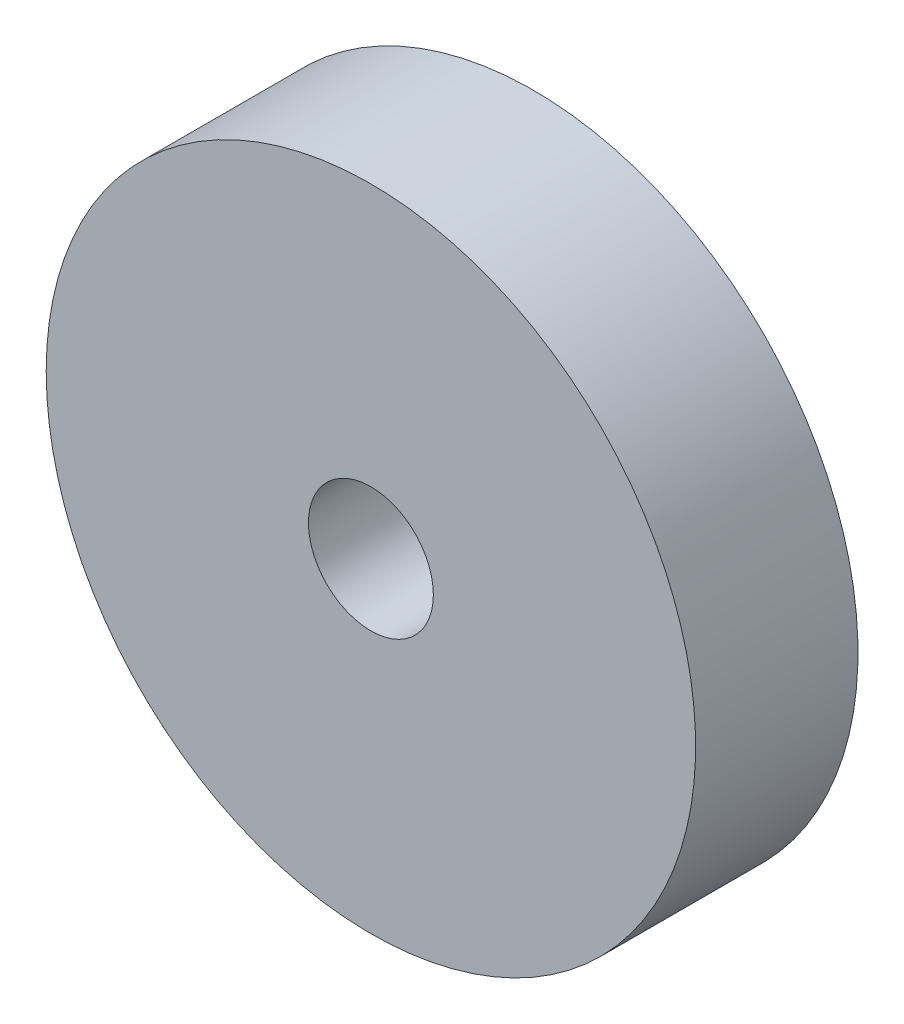
ISO-10303-21;
HEADER;
FILE_DESCRIPTION(('STEP AP214'),'2;1');
FILE_NAME('part.step','',(''),(''),'','','');
FILE_SCHEMA(('AUTOMOTIVE_DESIGN { 1 0 10303 214 1 1 1 1 }'));
ENDSEC;
DATA;
#1=APPLICATION_CONTEXT('core data for automotive mechanical design processes');
#2=APPLICATION_PROTOCOL_DEFINITION('international standard','automotive_design',2000,#1);
#3=PRODUCT_CONTEXT('',#1,'mechanical');
#4=PRODUCT('Part','Part','',(#3));
#5=PRODUCT_RELATED_PRODUCT_CATEGORY('part','',(#4));
#6=PRODUCT_DEFINITION_FORMATION('','',#4);
#7=PRODUCT_DEFINITION_CONTEXT('part definition',#1,'design');
#8=PRODUCT_DEFINITION('design','',#6,#7);
#9=PRODUCT_DEFINITION_SHAPE('','',#8);
#10=(LENGTH_UNIT() NAMED_UNIT(*) SI_UNIT(.MILLI.,.METRE.));
#11=(NAMED_UNIT(*) PLANE_ANGLE_UNIT() SI_UNIT($,.RADIAN.));
#12=(NAMED_UNIT(*) SI_UNIT($,.STERADIAN.) SOLID_ANGLE_UNIT());
#13=UNCERTAINTY_MEASURE_WITH_UNIT(LENGTH_MEASURE(1.E-05),#10,'distance_accuracy_value','');
#14=(GEOMETRIC_REPRESENTATION_CONTEXT(3) GLOBAL_UNCERTAINTY_ASSIGNED_CONTEXT((#13)) GLOBAL_UNIT_ASSIGNED_CONTEXT((#10,
#11,#12)) REPRESENTATION_CONTEXT('',''));
#15=CARTESIAN_POINT('',(0.,0.,0.));
#16=DIRECTION('',(0.,0.,1.));
#17=DIRECTION('',(1.,0.,0.));
#18=AXIS2_PLACEMENT_3D('',#15,#16,#17);
#19=CARTESIAN_POINT('',(0.,0.,6.5));
#20=DIRECTION('',(0.,0.,-1.));
#21=DIRECTION('',(-1.,0.,0.));
#22=AXIS2_PLACEMENT_3D('',#19,#20,#21);
#23=CYLINDRICAL_SURFACE('',#22,13.);
#24=CARTESIAN_POINT('',(0.,0.,6.5));
#25=DIRECTION('',(0.,0.,1.));
#26=DIRECTION('',(1.,0.,0.));
#27=AXIS2_PLACEMENT_3D('',#24,#25,#26);
#28=CIRCLE('',#27,13.);
#29=CARTESIAN_POINT('',(-13.,0.,6.5));
#30=VERTEX_POINT('',#29);
#31=EDGE_CURVE('E10',#30,#30,#28,.T.);
#32=CARTESIAN_POINT('',(0.,0.,0.));
#33=DIRECTION('',(0.,0.,1.));
#34=DIRECTION('',(1.,0.,0.));
#35=AXIS2_PLACEMENT_3D('',#32,#33,#34);
#36=CIRCLE('',#35,13.);
#37=CARTESIAN_POINT('',(-13.,0.,0.));
#38=VERTEX_POINT('',#37);
#39=EDGE_CURVE('E34',#38,#38,#36,.T.);
#40=CARTESIAN_POINT('',(-13.,0.,6.5));
#41=CARTESIAN_POINT('',(-13.,0.,6.43229166666667));
#42=CARTESIAN_POINT('',(-13.,0.,6.36458333333333));
#43=CARTESIAN_POINT('',(-13.,0.,6.22916666666667));
#44=CARTESIAN_POINT('',(-13.,0.,6.16145833333333));
#45=CARTESIAN_POINT('',(-13.,0.,6.02604166666667));
#46=CARTESIAN_POINT('',(-13.,0.,5.95833333333333));
#47=CARTESIAN_POINT('',(-13.,0.,5.82291666666667));
#48=CARTESIAN_POINT('',(-13.,0.,5.75520833333333));
#49=CARTESIAN_POINT('',(-13.,0.,5.61979166666667));
#50=CARTESIAN_POINT('',(-13.,0.,5.55208333333333));
#51=CARTESIAN_POINT('',(-13.,0.,5.41666666666667));
#52=CARTESIAN_POINT('',(-13.,0.,5.34895833333333));
#53=CARTESIAN_POINT('',(-13.,0.,5.21354166666667));
#54=CARTESIAN_POINT('',(-13.,0.,5.14583333333333));
#55=CARTESIAN_POINT('',(-13.,0.,5.01041666666667));
#56=CARTESIAN_POINT('',(-13.,0.,4.94270833333333));
#57=CARTESIAN_POINT('',(-13.,0.,4.80729166666667));
#58=CARTESIAN_POINT('',(-13.,0.,4.73958333333333));
#59=CARTESIAN_POINT('',(-13.,0.,4.60416666666667));
#60=CARTESIAN_POINT('',(-13.,0.,4.53645833333333));
#61=CARTESIAN_POINT('',(-13.,0.,4.40104166666667));
#62=CARTESIAN_POINT('',(-13.,0.,4.33333333333333));
#63=CARTESIAN_POINT('',(-13.,0.,4.19791666666667));
#64=CARTESIAN_POINT('',(-13.,0.,4.13020833333333));
#65=CARTESIAN_POINT('',(-13.,0.,3.99479166666667));
#66=CARTESIAN_POINT('',(-13.,0.,3.92708333333333));
#67=CARTESIAN_POINT('',(-13.,0.,3.79166666666667));
#68=CARTESIAN_POINT('',(-13.,0.,3.72395833333333));
#69=CARTESIAN_POINT('',(-13.,0.,3.58854166666667));
#70=CARTESIAN_POINT('',(-13.,0.,3.52083333333333));
#71=CARTESIAN_POINT('',(-13.,0.,3.38541666666667));
#72=CARTESIAN_POINT('',(-13.,0.,3.31770833333333));
#73=CARTESIAN_POINT('',(-13.,0.,3.18229166666667));
#74=CARTESIAN_POINT('',(-13.,0.,3.11458333333333));
#75=CARTESIAN_POINT('',(-13.,0.,2.97916666666667));
#76=CARTESIAN_POINT('',(-13.,0.,2.91145833333333));
#77=CARTESIAN_POINT('',(-13.,0.,2.77604166666667));
#78=CARTESIAN_POINT('',(-13.,0.,2.70833333333333));
#79=CARTESIAN_POINT('',(-13.,0.,2.57291666666667));
#80=CARTESIAN_POINT('',(-13.,0.,2.50520833333333));
#81=CARTESIAN_POINT('',(-13.,0.,2.36979166666667));
#82=CARTESIAN_POINT('',(-13.,0.,2.30208333333333));
#83=CARTESIAN_POINT('',(-13.,0.,2.16666666666667));
#84=CARTESIAN_POINT('',(-13.,0.,2.09895833333333));
#85=CARTESIAN_POINT('',(-13.,0.,1.96354166666667));
#86=CARTESIAN_POINT('',(-13.,0.,1.89583333333333));
#87=CARTESIAN_POINT('',(-13.,0.,1.76041666666667));
#88=CARTESIAN_POINT('',(-13.,0.,1.69270833333333));
#89=CARTESIAN_POINT('',(-13.,0.,1.55729166666667));
#90=CARTESIAN_POINT('',(-13.,0.,1.48958333333333));
#91=CARTESIAN_POINT('',(-13.,0.,1.35416666666667));
#92=CARTESIAN_POINT('',(-13.,0.,1.28645833333333));
#93=CARTESIAN_POINT('',(-13.,0.,1.15104166666667));
#94=CARTESIAN_POINT('',(-13.,0.,1.08333333333333));
#95=CARTESIAN_POINT('',(-13.,0.,0.947916666666667));
#96=CARTESIAN_POINT('',(-13.,0.,0.880208333333333));
#97=CARTESIAN_POINT('',(-13.,0.,0.744791666666667));
#98=CARTESIAN_POINT('',(-13.,0.,0.677083333333333));
#99=CARTESIAN_POINT('',(-13.,0.,0.541666666666667));
#100=CARTESIAN_POINT('',(-13.,0.,0.473958333333333));
#101=CARTESIAN_POINT('',(-13.,0.,0.338541666666667));
#102=CARTESIAN_POINT('',(-13.,0.,0.270833333333334));
#103=CARTESIAN_POINT('',(-13.,0.,0.135416666666667));
#104=CARTESIAN_POINT('',(-13.,0.,0.0677083333333334));
#105=CARTESIAN_POINT('',(-13.,0.,0.));
#106=B_SPLINE_CURVE_WITH_KNOTS('',3,(#40,#41,#42,#43,#44,#45,#46,#47,#48,#49,#50,#51,#52,#53,
#54,#55,#56,#57,#58,#59,#60,#61,#62,#63,#64,#65,#66,#67,#68,#69,#70,#71,#72,#73,#74,#75,#76,#77,
#78,#79,#80,#81,#82,#83,#84,#85,#86,#87,#88,#89,#90,#91,#92,#93,#94,#95,#96,#97,#98,#99,#100,
#101,#102,#103,#104,#105),.UNSPECIFIED.,.F.,.F.,(4,2,2,2,2,2,2,2,2,2,2,2,2,2,2,2,2,2,2,2,2,2,2,
2,2,2,2,2,2,2,2,2,4),(0.,0.203125,0.40625,0.609375000000001,0.812500000000001,1.015625,1.21875,
1.421875,1.625,1.828125,2.03125,2.234375,2.4375,2.640625,2.84375,3.046875,3.25,3.453125,3.65625,
3.859375,4.0625,4.265625,4.46875,4.671875,4.875,5.078125,5.28125,5.484375,5.6875,5.890625,
6.09375,6.296875,6.5),.UNSPECIFIED.);
#107=EDGE_CURVE('BSEAM31',#30,#38,#106,.T.);
#108=ORIENTED_EDGE('',*,*,#31,.F.);
#109=ORIENTED_EDGE('',*,*,#39,.T.);
#110=ORIENTED_EDGE('',*,*,#107,.T.);
#111=ORIENTED_EDGE('',*,*,#107,.F.);
#112=EDGE_LOOP('',(#108,#110,#109,#111));
#113=FACE_BOUND('',#112,.T.);
#114=ADVANCED_FACE('F31',(#113),#23,.T.);
#115=CARTESIAN_POINT('',(0.,0.,6.5));
#116=DIRECTION('',(0.,0.,1.));
#117=DIRECTION('',(1.,0.,0.));
#118=AXIS2_PLACEMENT_3D('',#115,#116,#117);
#119=PLANE('',#118);
#120=CARTESIAN_POINT('',(0.,0.,6.5));
#121=DIRECTION('',(0.,0.,1.));
#122=DIRECTION('',(1.,0.,0.));
#123=AXIS2_PLACEMENT_3D('',#120,#121,#122);
#124=CIRCLE('',#123,2.5);
#125=CARTESIAN_POINT('',(2.5,0.,6.5));
#126=VERTEX_POINT('',#125);
#127=EDGE_CURVE('E45',#126,#126,#124,.T.);
#128=ORIENTED_EDGE('',*,*,#127,.F.);
#129=EDGE_LOOP('',(#128));
#130=FACE_BOUND('',#129,.T.);
#131=ORIENTED_EDGE('',*,*,#31,.T.);
#132=EDGE_LOOP('',(#131));
#133=FACE_BOUND('',#132,.T.);
#134=ADVANCED_FACE('F52',(#130,#133),#119,.T.);
#135=CARTESIAN_POINT('',(0.,0.,0.));
#136=DIRECTION('',(0.,0.,1.));
#137=DIRECTION('',(1.,0.,0.));
#138=AXIS2_PLACEMENT_3D('',#135,#136,#137);
#139=PLANE('',#138);
#140=CARTESIAN_POINT('',(0.,0.,0.));
#141=DIRECTION('',(0.,0.,1.));
#142=DIRECTION('',(1.,0.,0.));
#143=AXIS2_PLACEMENT_3D('',#140,#141,#142);
#144=CIRCLE('',#143,2.5);
#145=CARTESIAN_POINT('',(2.5,0.,0.));
#146=VERTEX_POINT('',#145);
#147=EDGE_CURVE('E41',#146,#146,#144,.F.);
#148=ORIENTED_EDGE('',*,*,#147,.F.);
#149=EDGE_LOOP('',(#148));
#150=FACE_BOUND('',#149,.T.);
#151=ORIENTED_EDGE('',*,*,#39,.F.);
#152=EDGE_LOOP('',(#151));
#153=FACE_BOUND('',#152,.T.);
#154=ADVANCED_FACE('F54',(#150,#153),#139,.F.);
#155=CARTESIAN_POINT('',(0.,0.,-0.00100000000000013));
#156=DIRECTION('',(0.,0.,1.));
#157=DIRECTION('',(1.,0.,0.));
#158=AXIS2_PLACEMENT_3D('',#155,#156,#157);
#159=CYLINDRICAL_SURFACE('',#158,2.5);
#160=CARTESIAN_POINT('',(2.5,0.,6.5));
#161=CARTESIAN_POINT('',(2.5,0.,6.43229166666667));
#162=CARTESIAN_POINT('',(2.5,0.,6.36458333333333));
#163=CARTESIAN_POINT('',(2.5,0.,6.22916666666667));
#164=CARTESIAN_POINT('',(2.5,0.,6.16145833333333));
#165=CARTESIAN_POINT('',(2.5,0.,6.02604166666667));
#166=CARTESIAN_POINT('',(2.5,0.,5.95833333333333));
#167=CARTESIAN_POINT('',(2.5,0.,5.82291666666667));
#168=CARTESIAN_POINT('',(2.5,0.,5.75520833333333));
#169=CARTESIAN_POINT('',(2.5,0.,5.61979166666667));
#170=CARTESIAN_POINT('',(2.5,0.,5.55208333333333));
#171=CARTESIAN_POINT('',(2.5,0.,5.41666666666667));
#172=CARTESIAN_POINT('',(2.5,0.,5.34895833333333));
#173=CARTESIAN_POINT('',(2.5,0.,5.21354166666667));
#174=CARTESIAN_POINT('',(2.5,0.,5.14583333333333));
#175=CARTESIAN_POINT('',(2.5,0.,5.01041666666667));
#176=CARTESIAN_POINT('',(2.5,0.,4.94270833333333));
#177=CARTESIAN_POINT('',(2.5,0.,4.80729166666667));
#178=CARTESIAN_POINT('',(2.5,0.,4.73958333333333));
#179=CARTESIAN_POINT('',(2.5,0.,4.60416666666667));
#180=CARTESIAN_POINT('',(2.5,0.,4.53645833333333));
#181=CARTESIAN_POINT('',(2.5,0.,4.40104166666667));
#182=CARTESIAN_POINT('',(2.5,0.,4.33333333333333));
#183=CARTESIAN_POINT('',(2.5,0.,4.19791666666667));
#184=CARTESIAN_POINT('',(2.5,0.,4.13020833333333));
#185=CARTESIAN_POINT('',(2.5,0.,3.99479166666667));
#186=CARTESIAN_POINT('',(2.5,0.,3.92708333333333));
#187=CARTESIAN_POINT('',(2.5,0.,3.79166666666667));
#188=CARTESIAN_POINT('',(2.5,0.,3.72395833333333));
#189=CARTESIAN_POINT('',(2.5,0.,3.58854166666667));
#190=CARTESIAN_POINT('',(2.5,0.,3.52083333333333));
#191=CARTESIAN_POINT('',(2.5,0.,3.38541666666667));
#192=CARTESIAN_POINT('',(2.5,0.,3.31770833333333));
#193=CARTESIAN_POINT('',(2.5,0.,3.18229166666667));
#194=CARTESIAN_POINT('',(2.5,0.,3.11458333333333));
#195=CARTESIAN_POINT('',(2.5,0.,2.97916666666667));
#196=CARTESIAN_POINT('',(2.5,0.,2.91145833333333));
#197=CARTESIAN_POINT('',(2.5,0.,2.77604166666667));
#198=CARTESIAN_POINT('',(2.5,0.,2.70833333333333));
#199=CARTESIAN_POINT('',(2.5,0.,2.57291666666667));
#200=CARTESIAN_POINT('',(2.5,0.,2.50520833333333));
#201=CARTESIAN_POINT('',(2.5,0.,2.36979166666667));
#202=CARTESIAN_POINT('',(2.5,0.,2.30208333333333));
#203=CARTESIAN_POINT('',(2.5,0.,2.16666666666667));
#204=CARTESIAN_POINT('',(2.5,0.,2.09895833333333));
#205=CARTESIAN_POINT('',(2.5,0.,1.96354166666667));
#206=CARTESIAN_POINT('',(2.5,0.,1.89583333333333));
#207=CARTESIAN_POINT('',(2.5,0.,1.76041666666667));
#208=CARTESIAN_POINT('',(2.5,0.,1.69270833333333));
#209=CARTESIAN_POINT('',(2.5,0.,1.55729166666667));
#210=CARTESIAN_POINT('',(2.5,0.,1.48958333333333));
#211=CARTESIAN_POINT('',(2.5,0.,1.35416666666667));
#212=CARTESIAN_POINT('',(2.5,0.,1.28645833333333));
#213=CARTESIAN_POINT('',(2.5,0.,1.15104166666667));
#214=CARTESIAN_POINT('',(2.5,0.,1.08333333333333));
#215=CARTESIAN_POINT('',(2.5,0.,0.947916666666666));
#216=CARTESIAN_POINT('',(2.5,0.,0.880208333333333));
#217=CARTESIAN_POINT('',(2.5,0.,0.744791666666666));
#218=CARTESIAN_POINT('',(2.5,0.,0.677083333333333));
#219=CARTESIAN_POINT('',(2.5,0.,0.541666666666667));
#220=CARTESIAN_POINT('',(2.5,0.,0.473958333333333));
#221=CARTESIAN_POINT('',(2.5,0.,0.338541666666667));
#222=CARTESIAN_POINT('',(2.5,0.,0.270833333333334));
#223=CARTESIAN_POINT('',(2.5,0.,0.135416666666667));
#224=CARTESIAN_POINT('',(2.5,0.,0.0677083333333334));
#225=CARTESIAN_POINT('',(2.5,0.,0.));
#226=B_SPLINE_CURVE_WITH_KNOTS('',3,(#160,#161,#162,#163,#164,#165,#166,#167,#168,#169,#170,
#171,#172,#173,#174,#175,#176,#177,#178,#179,#180,#181,#182,#183,#184,#185,#186,#187,#188,#189,
#190,#191,#192,#193,#194,#195,#196,#197,#198,#199,#200,#201,#202,#203,#204,#205,#206,#207,#208,
#209,#210,#211,#212,#213,#214,#215,#216,#217,#218,#219,#220,#221,#222,#223,#224,#225),
.UNSPECIFIED.,.F.,.F.,(4,2,2,2,2,2,2,2,2,2,2,2,2,2,2,2,2,2,2,2,2,2,2,2,2,2,2,2,2,2,2,2,4),(0.,
0.203125,0.40625,0.609375,0.8125,1.015625,1.21875,1.421875,1.625,1.828125,2.03125,2.234375,
2.4375,2.640625,2.84375,3.046875,3.25,3.453125,3.65625,3.859375,4.0625,4.265625,4.46875,
4.671875,4.875,5.078125,5.28125,5.484375,5.6875,5.890625,6.09375,6.296875,6.5),.UNSPECIFIED.);
#227=EDGE_CURVE('BSEAM49',#126,#146,#226,.T.);
#228=ORIENTED_EDGE('',*,*,#127,.T.);
#229=ORIENTED_EDGE('',*,*,#147,.T.);
#230=ORIENTED_EDGE('',*,*,#227,.T.);
#231=ORIENTED_EDGE('',*,*,#227,.F.);
#232=EDGE_LOOP('',(#228,#230,#229,#231));
#233=FACE_BOUND('',#232,.T.);
#234=ADVANCED_FACE('F49',(#233),#159,.F.);
#235=CLOSED_SHELL('',(#114,#134,#154,#234));
#236=MANIFOLD_SOLID_BREP('B2',#235);
#237=ADVANCED_BREP_SHAPE_REPRESENTATION('',(#18,#236),#14);
#238=SHAPE_DEFINITION_REPRESENTATION(#9,#237);
ENDSEC;
END-ISO-10303-21;
